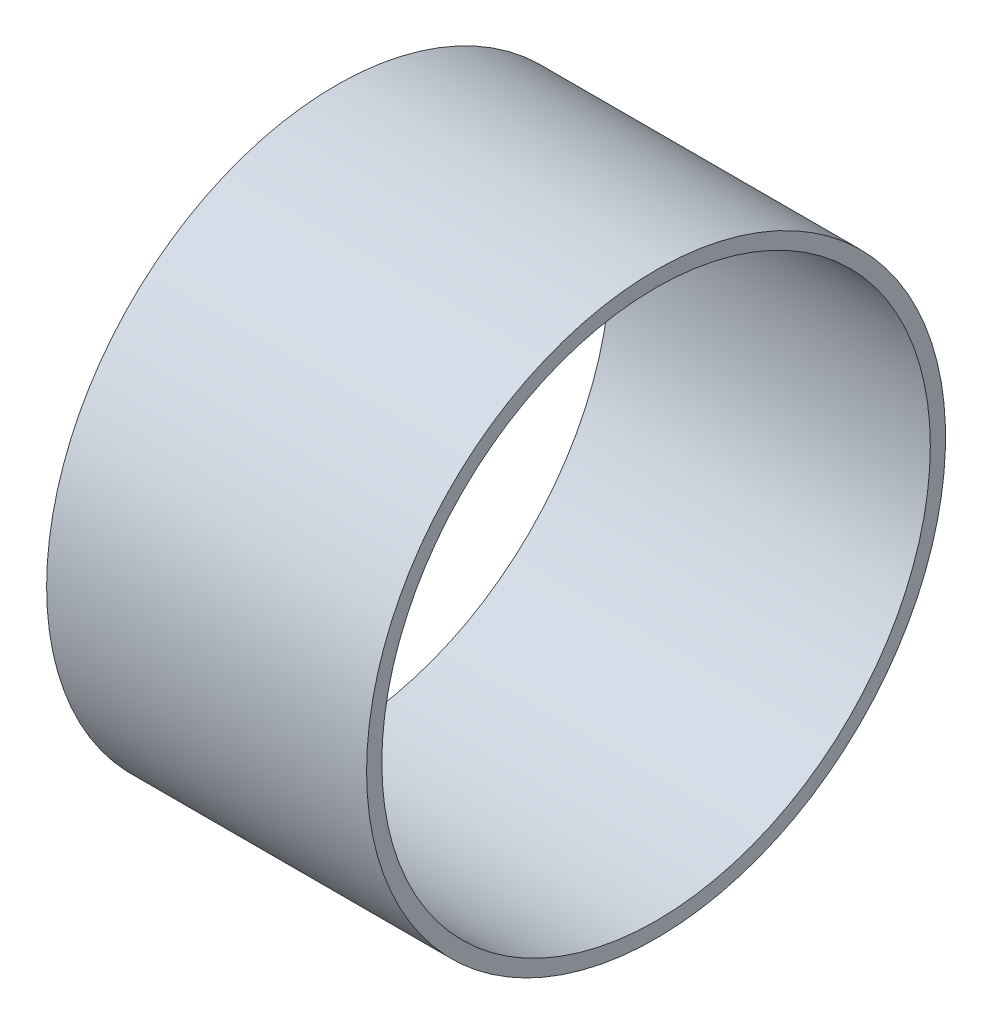
ISO-10303-21;
HEADER;
FILE_DESCRIPTION(('STEP AP214'),'2;1');
FILE_NAME('part.step','',(''),(''),'','','');
FILE_SCHEMA(('AUTOMOTIVE_DESIGN { 1 0 10303 214 1 1 1 1 }'));
ENDSEC;
DATA;
#1=APPLICATION_CONTEXT('core data for automotive mechanical design processes');
#2=APPLICATION_PROTOCOL_DEFINITION('international standard','automotive_design',2000,#1);
#3=PRODUCT_CONTEXT('',#1,'mechanical');
#4=PRODUCT('Part','Part','',(#3));
#5=PRODUCT_RELATED_PRODUCT_CATEGORY('part','',(#4));
#6=PRODUCT_DEFINITION_FORMATION('','',#4);
#7=PRODUCT_DEFINITION_CONTEXT('part definition',#1,'design');
#8=PRODUCT_DEFINITION('design','',#6,#7);
#9=PRODUCT_DEFINITION_SHAPE('','',#8);
#10=(LENGTH_UNIT() NAMED_UNIT(*) SI_UNIT(.MILLI.,.METRE.));
#11=(NAMED_UNIT(*) PLANE_ANGLE_UNIT() SI_UNIT($,.RADIAN.));
#12=(NAMED_UNIT(*) SI_UNIT($,.STERADIAN.) SOLID_ANGLE_UNIT());
#13=UNCERTAINTY_MEASURE_WITH_UNIT(LENGTH_MEASURE(1.E-05),#10,'distance_accuracy_value','');
#14=(GEOMETRIC_REPRESENTATION_CONTEXT(3) GLOBAL_UNCERTAINTY_ASSIGNED_CONTEXT((#13)) GLOBAL_UNIT_ASSIGNED_CONTEXT((#10,
#11,#12)) REPRESENTATION_CONTEXT('',''));
#15=CARTESIAN_POINT('',(0.,0.,0.));
#16=DIRECTION('',(0.,0.,1.));
#17=DIRECTION('',(1.,0.,0.));
#18=AXIS2_PLACEMENT_3D('',#15,#16,#17);
#19=CARTESIAN_POINT('',(42.,0.,0.));
#20=DIRECTION('',(-1.,0.,0.));
#21=DIRECTION('',(0.,0.,1.));
#22=AXIS2_PLACEMENT_3D('',#19,#20,#21);
#23=CYLINDRICAL_SURFACE('',#22,38.);
#24=CARTESIAN_POINT('',(42.,0.,0.));
#25=DIRECTION('',(-1.,0.,0.));
#26=DIRECTION('',(0.,0.,1.));
#27=AXIS2_PLACEMENT_3D('',#24,#25,#26);
#28=CIRCLE('',#27,38.);
#29=CARTESIAN_POINT('',(42.,0.,38.));
#30=VERTEX_POINT('',#29);
#31=EDGE_CURVE('E10',#30,#30,#28,.T.);
#32=ORIENTED_EDGE('',*,*,#31,.T.);
#33=EDGE_LOOP('',(#32));
#34=FACE_BOUND('',#33,.T.);
#35=CARTESIAN_POINT('',(0.,0.,0.));
#36=DIRECTION('',(-1.,0.,0.));
#37=DIRECTION('',(0.,0.,1.));
#38=AXIS2_PLACEMENT_3D('',#35,#36,#37);
#39=CIRCLE('',#38,38.);
#40=CARTESIAN_POINT('',(0.,0.,38.));
#41=VERTEX_POINT('',#40);
#42=EDGE_CURVE('E52',#41,#41,#39,.T.);
#43=ORIENTED_EDGE('',*,*,#42,.F.);
#44=EDGE_LOOP('',(#43));
#45=FACE_BOUND('',#44,.T.);
#46=ADVANCED_FACE('F38',(#34,#45),#23,.T.);
#47=CARTESIAN_POINT('',(42.,38.,0.));
#48=DIRECTION('',(1.,0.,0.));
#49=DIRECTION('',(0.,0.,-1.));
#50=AXIS2_PLACEMENT_3D('',#47,#48,#49);
#51=PLANE('',#50);
#52=CARTESIAN_POINT('',(42.,0.,0.));
#53=DIRECTION('',(-1.,0.,0.));
#54=DIRECTION('',(0.,0.,1.));
#55=AXIS2_PLACEMENT_3D('',#52,#53,#54);
#56=CIRCLE('',#55,36.);
#57=CARTESIAN_POINT('',(42.,0.,36.));
#58=VERTEX_POINT('',#57);
#59=EDGE_CURVE('E44',#58,#58,#56,.T.);
#60=ORIENTED_EDGE('',*,*,#59,.T.);
#61=EDGE_LOOP('',(#60));
#62=FACE_BOUND('',#61,.T.);
#63=ORIENTED_EDGE('',*,*,#31,.F.);
#64=EDGE_LOOP('',(#63));
#65=FACE_BOUND('',#64,.T.);
#66=ADVANCED_FACE('F62',(#62,#65),#51,.T.);
#67=CARTESIAN_POINT('',(42.,0.,0.));
#68=DIRECTION('',(-1.,0.,0.));
#69=DIRECTION('',(0.,0.,1.));
#70=AXIS2_PLACEMENT_3D('',#67,#68,#69);
#71=CYLINDRICAL_SURFACE('',#70,36.);
#72=CARTESIAN_POINT('',(0.,0.,0.));
#73=DIRECTION('',(-1.,0.,0.));
#74=DIRECTION('',(0.,0.,1.));
#75=AXIS2_PLACEMENT_3D('',#72,#73,#74);
#76=CIRCLE('',#75,36.);
#77=CARTESIAN_POINT('',(0.,0.,36.));
#78=VERTEX_POINT('',#77);
#79=EDGE_CURVE('E48',#78,#78,#76,.T.);
#80=ORIENTED_EDGE('',*,*,#79,.T.);
#81=EDGE_LOOP('',(#80));
#82=FACE_BOUND('',#81,.T.);
#83=ORIENTED_EDGE('',*,*,#59,.F.);
#84=EDGE_LOOP('',(#83));
#85=FACE_BOUND('',#84,.T.);
#86=ADVANCED_FACE('F66',(#82,#85),#71,.F.);
#87=CARTESIAN_POINT('',(0.,36.,0.));
#88=DIRECTION('',(-1.,0.,0.));
#89=DIRECTION('',(0.,0.,1.));
#90=AXIS2_PLACEMENT_3D('',#87,#88,#89);
#91=PLANE('',#90);
#92=ORIENTED_EDGE('',*,*,#42,.T.);
#93=EDGE_LOOP('',(#92));
#94=FACE_BOUND('',#93,.T.);
#95=ORIENTED_EDGE('',*,*,#79,.F.);
#96=EDGE_LOOP('',(#95));
#97=FACE_BOUND('',#96,.T.);
#98=ADVANCED_FACE('F58',(#94,#97),#91,.T.);
#99=CLOSED_SHELL('',(#46,#66,#86,#98));
#100=MANIFOLD_SOLID_BREP('B2',#99);
#101=ADVANCED_BREP_SHAPE_REPRESENTATION('',(#18,#100),#14);
#102=SHAPE_DEFINITION_REPRESENTATION(#9,#101);
ENDSEC;
END-ISO-10303-21;
